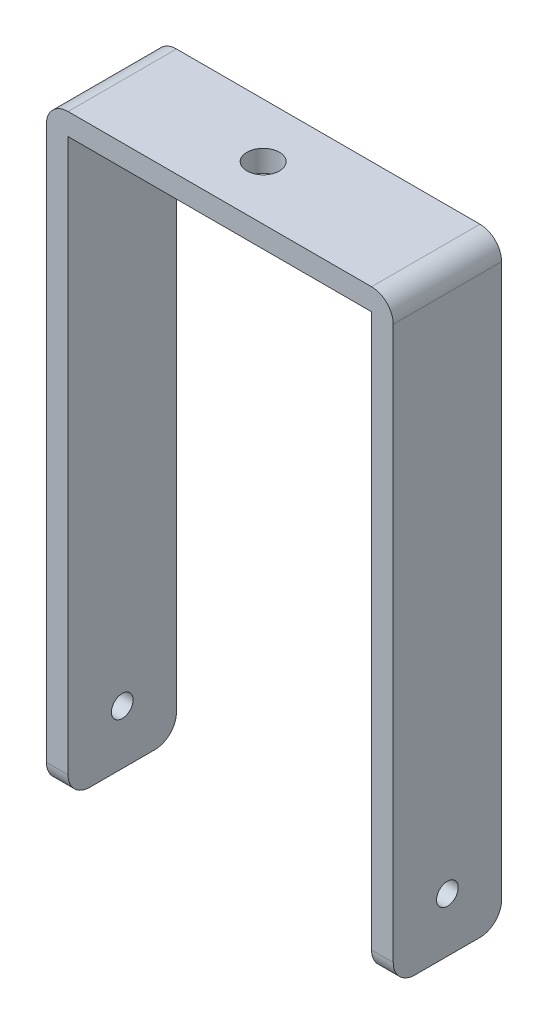
ISO-10303-21;
HEADER;
FILE_DESCRIPTION(('STEP AP214'),'2;1');
FILE_NAME('part.step','',(''),(''),'','','');
FILE_SCHEMA(('AUTOMOTIVE_DESIGN { 1 0 10303 214 1 1 1 1 }'));
ENDSEC;
DATA;
#1=APPLICATION_CONTEXT('core data for automotive mechanical design processes');
#2=APPLICATION_PROTOCOL_DEFINITION('international standard','automotive_design',2000,#1);
#3=PRODUCT_CONTEXT('',#1,'mechanical');
#4=PRODUCT('Part','Part','',(#3));
#5=PRODUCT_RELATED_PRODUCT_CATEGORY('part','',(#4));
#6=PRODUCT_DEFINITION_FORMATION('','',#4);
#7=PRODUCT_DEFINITION_CONTEXT('part definition',#1,'design');
#8=PRODUCT_DEFINITION('design','',#6,#7);
#9=PRODUCT_DEFINITION_SHAPE('','',#8);
#10=(LENGTH_UNIT() NAMED_UNIT(*) SI_UNIT(.MILLI.,.METRE.));
#11=(NAMED_UNIT(*) PLANE_ANGLE_UNIT() SI_UNIT($,.RADIAN.));
#12=(NAMED_UNIT(*) SI_UNIT($,.STERADIAN.) SOLID_ANGLE_UNIT());
#13=UNCERTAINTY_MEASURE_WITH_UNIT(LENGTH_MEASURE(1.E-05),#10,'distance_accuracy_value','');
#14=(GEOMETRIC_REPRESENTATION_CONTEXT(3) GLOBAL_UNCERTAINTY_ASSIGNED_CONTEXT((#13)) GLOBAL_UNIT_ASSIGNED_CONTEXT((#10,
#11,#12)) REPRESENTATION_CONTEXT('',''));
#15=CARTESIAN_POINT('',(0.,0.,0.));
#16=DIRECTION('',(0.,0.,1.));
#17=DIRECTION('',(1.,0.,0.));
#18=AXIS2_PLACEMENT_3D('',#15,#16,#17);
#19=CARTESIAN_POINT('',(10.,0.,50.));
#20=DIRECTION('',(0.,1.,0.));
#21=DIRECTION('',(-1.,0.,0.));
#22=AXIS2_PLACEMENT_3D('',#19,#20,#21);
#23=PLANE('',#22);
#24=DIRECTION('',(0.,0.,-1.));
#25=VECTOR('',#24,1.);
#26=CARTESIAN_POINT('',(10.,0.,50.));
#27=LINE('',#26,#25);
#28=CARTESIAN_POINT('',(10.,0.,40.));
#29=VERTEX_POINT('',#28);
#30=CARTESIAN_POINT('',(10.,0.,10.));
#31=VERTEX_POINT('',#30);
#32=EDGE_CURVE('E155',#29,#31,#27,.T.);
#33=ORIENTED_EDGE('',*,*,#32,.F.);
#34=DIRECTION('',(1.,0.,0.));
#35=VECTOR('',#34,1.);
#36=CARTESIAN_POINT('',(10.,0.,40.));
#37=LINE('',#36,#35);
#38=CARTESIAN_POINT('',(0.,0.,40.));
#39=VERTEX_POINT('',#38);
#40=EDGE_CURVE('E214',#29,#39,#37,.F.);
#41=ORIENTED_EDGE('',*,*,#40,.T.);
#42=DIRECTION('',(0.,0.,-1.));
#43=VECTOR('',#42,1.);
#44=CARTESIAN_POINT('',(0.,0.,50.));
#45=LINE('',#44,#43);
#46=CARTESIAN_POINT('',(0.,0.,10.));
#47=VERTEX_POINT('',#46);
#48=EDGE_CURVE('E174',#39,#47,#45,.T.);
#49=ORIENTED_EDGE('',*,*,#48,.T.);
#50=DIRECTION('',(1.,0.,0.));
#51=VECTOR('',#50,1.);
#52=CARTESIAN_POINT('',(10.,0.,10.));
#53=LINE('',#52,#51);
#54=EDGE_CURVE('E211',#47,#31,#53,.T.);
#55=ORIENTED_EDGE('',*,*,#54,.T.);
#56=EDGE_LOOP('',(#33,#41,#49,#55));
#57=FACE_BOUND('',#56,.T.);
#58=ADVANCED_FACE('F33',(#57),#23,.F.);
#59=CARTESIAN_POINT('',(9.99999999999997,265.,50.));
#60=DIRECTION('',(-1.,0.,0.));
#61=DIRECTION('',(0.,-1.,0.));
#62=AXIS2_PLACEMENT_3D('',#59,#60,#61);
#63=PLANE('',#62);
#64=CARTESIAN_POINT('',(10.,25.,25.));
#65=DIRECTION('',(-1.,0.,0.));
#66=DIRECTION('',(0.,-1.,0.));
#67=AXIS2_PLACEMENT_3D('',#64,#65,#66);
#68=CIRCLE('',#67,5.);
#69=CARTESIAN_POINT('',(10.,20.,25.));
#70=VERTEX_POINT('',#69);
#71=EDGE_CURVE('E177',#70,#70,#68,.T.);
#72=ORIENTED_EDGE('',*,*,#71,.T.);
#73=EDGE_LOOP('',(#72));
#74=FACE_BOUND('',#73,.T.);
#75=DIRECTION('',(0.,1.,0.));
#76=VECTOR('',#75,1.);
#77=CARTESIAN_POINT('',(9.99999999999997,265.,50.));
#78=LINE('',#77,#76);
#79=CARTESIAN_POINT('',(10.,10.,50.));
#80=VERTEX_POINT('',#79);
#81=CARTESIAN_POINT('',(9.99999999999997,265.,50.));
#82=VERTEX_POINT('',#81);
#83=EDGE_CURVE('E135',#80,#82,#78,.T.);
#84=ORIENTED_EDGE('',*,*,#83,.F.);
#85=CARTESIAN_POINT('',(10.,10.,40.));
#86=DIRECTION('',(-1.,0.,0.));
#87=DIRECTION('',(0.,-1.,0.));
#88=AXIS2_PLACEMENT_3D('',#85,#86,#87);
#89=CIRCLE('',#88,10.);
#90=EDGE_CURVE('E209',#80,#29,#89,.F.);
#91=ORIENTED_EDGE('',*,*,#90,.T.);
#92=ORIENTED_EDGE('',*,*,#32,.T.);
#93=CARTESIAN_POINT('',(10.,10.,10.));
#94=DIRECTION('',(-1.,0.,0.));
#95=DIRECTION('',(0.,-1.,0.));
#96=AXIS2_PLACEMENT_3D('',#93,#94,#95);
#97=CIRCLE('',#96,10.);
#98=CARTESIAN_POINT('',(10.,10.,0.));
#99=VERTEX_POINT('',#98);
#100=EDGE_CURVE('E207',#31,#99,#97,.F.);
#101=ORIENTED_EDGE('',*,*,#100,.T.);
#102=DIRECTION('',(0.,1.,0.));
#103=VECTOR('',#102,1.);
#104=CARTESIAN_POINT('',(9.99999999999997,265.,0.));
#105=LINE('',#104,#103);
#106=CARTESIAN_POINT('',(9.99999999999997,265.,0.));
#107=VERTEX_POINT('',#106);
#108=EDGE_CURVE('E152',#99,#107,#105,.T.);
#109=ORIENTED_EDGE('',*,*,#108,.T.);
#110=DIRECTION('',(0.,0.,-1.));
#111=VECTOR('',#110,1.);
#112=CARTESIAN_POINT('',(9.99999999999997,265.,50.));
#113=LINE('',#112,#111);
#114=EDGE_CURVE('E149',#82,#107,#113,.T.);
#115=ORIENTED_EDGE('',*,*,#114,.F.);
#116=EDGE_LOOP('',(#84,#91,#92,#101,#109,#115));
#117=FACE_BOUND('',#116,.T.);
#118=ADVANCED_FACE('F150',(#74,#117),#63,.F.);
#119=CARTESIAN_POINT('',(150.,265.,50.));
#120=DIRECTION('',(0.,1.,0.));
#121=DIRECTION('',(0.,0.,1.));
#122=AXIS2_PLACEMENT_3D('',#119,#120,#121);
#123=PLANE('',#122);
#124=CARTESIAN_POINT('',(74.9999999999999,265.,25.));
#125=DIRECTION('',(0.,1.,0.));
#126=DIRECTION('',(0.,0.,1.));
#127=AXIS2_PLACEMENT_3D('',#124,#125,#126);
#128=CIRCLE('',#127,7.50000000000001);
#129=CARTESIAN_POINT('',(74.9999999999999,265.,32.5));
#130=VERTEX_POINT('',#129);
#131=EDGE_CURVE('E454',#130,#130,#128,.T.);
#132=ORIENTED_EDGE('',*,*,#131,.T.);
#133=EDGE_LOOP('',(#132));
#134=FACE_BOUND('',#133,.T.);
#135=DIRECTION('',(1.,0.,0.));
#136=VECTOR('',#135,1.);
#137=CARTESIAN_POINT('',(150.,265.,0.));
#138=LINE('',#137,#136);
#139=CARTESIAN_POINT('',(150.,265.,0.));
#140=VERTEX_POINT('',#139);
#141=EDGE_CURVE('E176',#107,#140,#138,.T.);
#142=ORIENTED_EDGE('',*,*,#141,.T.);
#143=DIRECTION('',(0.,0.,-1.));
#144=VECTOR('',#143,1.);
#145=CARTESIAN_POINT('',(150.,265.,50.));
#146=LINE('',#145,#144);
#147=CARTESIAN_POINT('',(150.,265.,50.));
#148=VERTEX_POINT('',#147);
#149=EDGE_CURVE('E156',#148,#140,#146,.T.);
#150=ORIENTED_EDGE('',*,*,#149,.F.);
#151=DIRECTION('',(1.,0.,0.));
#152=VECTOR('',#151,1.);
#153=CARTESIAN_POINT('',(150.,265.,50.));
#154=LINE('',#153,#152);
#155=EDGE_CURVE('E141',#82,#148,#154,.T.);
#156=ORIENTED_EDGE('',*,*,#155,.F.);
#157=ORIENTED_EDGE('',*,*,#114,.T.);
#158=EDGE_LOOP('',(#142,#150,#156,#157));
#159=FACE_BOUND('',#158,.T.);
#160=ADVANCED_FACE('F158',(#134,#159),#123,.F.);
#161=CARTESIAN_POINT('',(150.,0.,50.));
#162=DIRECTION('',(1.,0.,0.));
#163=DIRECTION('',(0.,0.,-1.));
#164=AXIS2_PLACEMENT_3D('',#161,#162,#163);
#165=PLANE('',#164);
#166=CARTESIAN_POINT('',(150.,25.,25.));
#167=DIRECTION('',(1.,0.,0.));
#168=DIRECTION('',(0.,0.,-1.));
#169=AXIS2_PLACEMENT_3D('',#166,#167,#168);
#170=CIRCLE('',#169,5.);
#171=CARTESIAN_POINT('',(150.,25.,20.));
#172=VERTEX_POINT('',#171);
#173=EDGE_CURVE('E467',#172,#172,#170,.T.);
#174=ORIENTED_EDGE('',*,*,#173,.T.);
#175=EDGE_LOOP('',(#174));
#176=FACE_BOUND('',#175,.T.);
#177=DIRECTION('',(0.,0.,-1.));
#178=VECTOR('',#177,1.);
#179=CARTESIAN_POINT('',(150.,0.,50.));
#180=LINE('',#179,#178);
#181=CARTESIAN_POINT('',(150.,0.,40.));
#182=VERTEX_POINT('',#181);
#183=CARTESIAN_POINT('',(150.,0.,10.));
#184=VERTEX_POINT('',#183);
#185=EDGE_CURVE('E194',#182,#184,#180,.T.);
#186=ORIENTED_EDGE('',*,*,#185,.F.);
#187=CARTESIAN_POINT('',(150.,10.,40.));
#188=DIRECTION('',(1.,0.,0.));
#189=DIRECTION('',(0.,0.,-1.));
#190=AXIS2_PLACEMENT_3D('',#187,#188,#189);
#191=CIRCLE('',#190,10.);
#192=CARTESIAN_POINT('',(150.,10.,50.));
#193=VERTEX_POINT('',#192);
#194=EDGE_CURVE('E242',#182,#193,#191,.F.);
#195=ORIENTED_EDGE('',*,*,#194,.T.);
#196=DIRECTION('',(0.,-1.,0.));
#197=VECTOR('',#196,1.);
#198=CARTESIAN_POINT('',(150.,0.,50.));
#199=LINE('',#198,#197);
#200=EDGE_CURVE('E161',#148,#193,#199,.T.);
#201=ORIENTED_EDGE('',*,*,#200,.F.);
#202=ORIENTED_EDGE('',*,*,#149,.T.);
#203=DIRECTION('',(0.,-1.,0.));
#204=VECTOR('',#203,1.);
#205=CARTESIAN_POINT('',(150.,0.,0.));
#206=LINE('',#205,#204);
#207=CARTESIAN_POINT('',(150.,10.,0.));
#208=VERTEX_POINT('',#207);
#209=EDGE_CURVE('E179',#140,#208,#206,.T.);
#210=ORIENTED_EDGE('',*,*,#209,.T.);
#211=CARTESIAN_POINT('',(150.,10.,10.));
#212=DIRECTION('',(1.,0.,0.));
#213=DIRECTION('',(0.,0.,-1.));
#214=AXIS2_PLACEMENT_3D('',#211,#212,#213);
#215=CIRCLE('',#214,10.);
#216=EDGE_CURVE('E48',#208,#184,#215,.F.);
#217=ORIENTED_EDGE('',*,*,#216,.T.);
#218=EDGE_LOOP('',(#186,#195,#201,#202,#210,#217));
#219=FACE_BOUND('',#218,.T.);
#220=ADVANCED_FACE('F276',(#176,#219),#165,.F.);
#221=CARTESIAN_POINT('',(160.,0.,50.));
#222=DIRECTION('',(0.,1.,0.));
#223=DIRECTION('',(-1.,0.,0.));
#224=AXIS2_PLACEMENT_3D('',#221,#222,#223);
#225=PLANE('',#224);
#226=DIRECTION('',(0.,0.,-1.));
#227=VECTOR('',#226,1.);
#228=CARTESIAN_POINT('',(160.,0.,50.));
#229=LINE('',#228,#227);
#230=CARTESIAN_POINT('',(160.,0.,40.));
#231=VERTEX_POINT('',#230);
#232=CARTESIAN_POINT('',(160.,0.,10.));
#233=VERTEX_POINT('',#232);
#234=EDGE_CURVE('E191',#231,#233,#229,.T.);
#235=ORIENTED_EDGE('',*,*,#234,.F.);
#236=DIRECTION('',(1.,0.,0.));
#237=VECTOR('',#236,1.);
#238=CARTESIAN_POINT('',(160.,0.,40.));
#239=LINE('',#238,#237);
#240=EDGE_CURVE('E55',#231,#182,#239,.F.);
#241=ORIENTED_EDGE('',*,*,#240,.T.);
#242=ORIENTED_EDGE('',*,*,#185,.T.);
#243=DIRECTION('',(1.,0.,0.));
#244=VECTOR('',#243,1.);
#245=CARTESIAN_POINT('',(160.,0.,10.));
#246=LINE('',#245,#244);
#247=EDGE_CURVE('E237',#184,#233,#246,.T.);
#248=ORIENTED_EDGE('',*,*,#247,.T.);
#249=EDGE_LOOP('',(#235,#241,#242,#248));
#250=FACE_BOUND('',#249,.T.);
#251=ADVANCED_FACE('F284',(#250),#225,.F.);
#252=CARTESIAN_POINT('',(160.,275.,50.));
#253=DIRECTION('',(-1.,0.,0.));
#254=DIRECTION('',(0.,-1.,0.));
#255=AXIS2_PLACEMENT_3D('',#252,#253,#254);
#256=PLANE('',#255);
#257=CARTESIAN_POINT('',(160.,25.,25.));
#258=DIRECTION('',(-1.,0.,0.));
#259=DIRECTION('',(0.,-1.,0.));
#260=AXIS2_PLACEMENT_3D('',#257,#258,#259);
#261=CIRCLE('',#260,5.);
#262=CARTESIAN_POINT('',(160.,20.,25.));
#263=VERTEX_POINT('',#262);
#264=EDGE_CURVE('E464',#263,#263,#261,.T.);
#265=ORIENTED_EDGE('',*,*,#264,.T.);
#266=EDGE_LOOP('',(#265));
#267=FACE_BOUND('',#266,.T.);
#268=DIRECTION('',(0.,1.,0.));
#269=VECTOR('',#268,1.);
#270=CARTESIAN_POINT('',(160.,275.,50.));
#271=LINE('',#270,#269);
#272=CARTESIAN_POINT('',(160.,10.,50.));
#273=VERTEX_POINT('',#272);
#274=CARTESIAN_POINT('',(160.,265.,50.));
#275=VERTEX_POINT('',#274);
#276=EDGE_CURVE('E163',#273,#275,#271,.T.);
#277=ORIENTED_EDGE('',*,*,#276,.F.);
#278=CARTESIAN_POINT('',(160.,10.,40.));
#279=DIRECTION('',(-1.,0.,0.));
#280=DIRECTION('',(0.,-1.,0.));
#281=AXIS2_PLACEMENT_3D('',#278,#279,#280);
#282=CIRCLE('',#281,10.);
#283=EDGE_CURVE('E235',#273,#231,#282,.F.);
#284=ORIENTED_EDGE('',*,*,#283,.T.);
#285=ORIENTED_EDGE('',*,*,#234,.T.);
#286=CARTESIAN_POINT('',(160.,10.,10.));
#287=DIRECTION('',(-1.,0.,0.));
#288=DIRECTION('',(0.,-1.,0.));
#289=AXIS2_PLACEMENT_3D('',#286,#287,#288);
#290=CIRCLE('',#289,10.);
#291=CARTESIAN_POINT('',(160.,10.,0.));
#292=VERTEX_POINT('',#291);
#293=EDGE_CURVE('E233',#233,#292,#290,.F.);
#294=ORIENTED_EDGE('',*,*,#293,.T.);
#295=DIRECTION('',(0.,1.,0.));
#296=VECTOR('',#295,1.);
#297=CARTESIAN_POINT('',(160.,275.,0.));
#298=LINE('',#297,#296);
#299=CARTESIAN_POINT('',(160.,265.,0.));
#300=VERTEX_POINT('',#299);
#301=EDGE_CURVE('E181',#292,#300,#298,.T.);
#302=ORIENTED_EDGE('',*,*,#301,.T.);
#303=DIRECTION('',(0.,0.,-1.));
#304=VECTOR('',#303,1.);
#305=CARTESIAN_POINT('',(160.,265.,50.));
#306=LINE('',#305,#304);
#307=EDGE_CURVE('E231',#300,#275,#306,.F.);
#308=ORIENTED_EDGE('',*,*,#307,.T.);
#309=EDGE_LOOP('',(#277,#284,#285,#294,#302,#308));
#310=FACE_BOUND('',#309,.T.);
#311=ADVANCED_FACE('F283',(#267,#310),#256,.F.);
#312=CARTESIAN_POINT('',(0.,275.,50.));
#313=DIRECTION('',(0.,-1.,0.));
#314=DIRECTION('',(0.,0.,-1.));
#315=AXIS2_PLACEMENT_3D('',#312,#313,#314);
#316=PLANE('',#315);
#317=CARTESIAN_POINT('',(74.9999999999999,275.,25.));
#318=DIRECTION('',(0.,1.,0.));
#319=DIRECTION('',(0.,0.,1.));
#320=AXIS2_PLACEMENT_3D('',#317,#318,#319);
#321=CIRCLE('',#320,7.50000000000001);
#322=CARTESIAN_POINT('',(74.9999999999999,275.,32.5));
#323=VERTEX_POINT('',#322);
#324=EDGE_CURVE('E457',#323,#323,#321,.T.);
#325=ORIENTED_EDGE('',*,*,#324,.F.);
#326=EDGE_LOOP('',(#325));
#327=FACE_BOUND('',#326,.T.);
#328=DIRECTION('',(-1.,0.,0.));
#329=VECTOR('',#328,1.);
#330=CARTESIAN_POINT('',(0.,275.,0.));
#331=LINE('',#330,#329);
#332=CARTESIAN_POINT('',(150.,275.,0.));
#333=VERTEX_POINT('',#332);
#334=CARTESIAN_POINT('',(9.99999999999997,275.,0.));
#335=VERTEX_POINT('',#334);
#336=EDGE_CURVE('E184',#333,#335,#331,.T.);
#337=ORIENTED_EDGE('',*,*,#336,.T.);
#338=DIRECTION('',(0.,0.,-1.));
#339=VECTOR('',#338,1.);
#340=CARTESIAN_POINT('',(9.99999999999997,275.,50.));
#341=LINE('',#340,#339);
#342=CARTESIAN_POINT('',(9.99999999999997,275.,50.));
#343=VERTEX_POINT('',#342);
#344=EDGE_CURVE('E11',#335,#343,#341,.F.);
#345=ORIENTED_EDGE('',*,*,#344,.T.);
#346=DIRECTION('',(-1.,0.,0.));
#347=VECTOR('',#346,1.);
#348=CARTESIAN_POINT('',(0.,275.,50.));
#349=LINE('',#348,#347);
#350=CARTESIAN_POINT('',(150.,275.,50.));
#351=VERTEX_POINT('',#350);
#352=EDGE_CURVE('E169',#351,#343,#349,.T.);
#353=ORIENTED_EDGE('',*,*,#352,.F.);
#354=DIRECTION('',(0.,0.,-1.));
#355=VECTOR('',#354,1.);
#356=CARTESIAN_POINT('',(150.,275.,50.));
#357=LINE('',#356,#355);
#358=EDGE_CURVE('E41',#351,#333,#357,.T.);
#359=ORIENTED_EDGE('',*,*,#358,.T.);
#360=EDGE_LOOP('',(#337,#345,#353,#359));
#361=FACE_BOUND('',#360,.T.);
#362=ADVANCED_FACE('F248',(#327,#361),#316,.F.);
#363=CARTESIAN_POINT('',(0.,0.,50.));
#364=DIRECTION('',(1.,0.,0.));
#365=DIRECTION('',(0.,1.,0.));
#366=AXIS2_PLACEMENT_3D('',#363,#364,#365);
#367=PLANE('',#366);
#368=CARTESIAN_POINT('',(0.,25.,25.));
#369=DIRECTION('',(-1.,0.,0.));
#370=DIRECTION('',(0.,-1.,0.));
#371=AXIS2_PLACEMENT_3D('',#368,#369,#370);
#372=CIRCLE('',#371,5.);
#373=CARTESIAN_POINT('',(0.,20.,25.));
#374=VERTEX_POINT('',#373);
#375=EDGE_CURVE('E459',#374,#374,#372,.T.);
#376=ORIENTED_EDGE('',*,*,#375,.F.);
#377=EDGE_LOOP('',(#376));
#378=FACE_BOUND('',#377,.T.);
#379=ORIENTED_EDGE('',*,*,#48,.F.);
#380=CARTESIAN_POINT('',(0.,10.,40.));
#381=DIRECTION('',(1.,0.,0.));
#382=DIRECTION('',(0.,1.,0.));
#383=AXIS2_PLACEMENT_3D('',#380,#381,#382);
#384=CIRCLE('',#383,10.);
#385=CARTESIAN_POINT('',(0.,10.,50.));
#386=VERTEX_POINT('',#385);
#387=EDGE_CURVE('E221',#39,#386,#384,.F.);
#388=ORIENTED_EDGE('',*,*,#387,.T.);
#389=DIRECTION('',(0.,-1.,0.));
#390=VECTOR('',#389,1.);
#391=CARTESIAN_POINT('',(0.,0.,50.));
#392=LINE('',#391,#390);
#393=CARTESIAN_POINT('',(0.,265.,50.));
#394=VERTEX_POINT('',#393);
#395=EDGE_CURVE('E172',#394,#386,#392,.T.);
#396=ORIENTED_EDGE('',*,*,#395,.F.);
#397=DIRECTION('',(0.,0.,-1.));
#398=VECTOR('',#397,1.);
#399=CARTESIAN_POINT('',(0.,265.,50.));
#400=LINE('',#399,#398);
#401=CARTESIAN_POINT('',(0.,265.,0.));
#402=VERTEX_POINT('',#401);
#403=EDGE_CURVE('E216',#394,#402,#400,.T.);
#404=ORIENTED_EDGE('',*,*,#403,.T.);
#405=DIRECTION('',(0.,-1.,0.));
#406=VECTOR('',#405,1.);
#407=CARTESIAN_POINT('',(0.,0.,0.));
#408=LINE('',#407,#406);
#409=CARTESIAN_POINT('',(0.,10.,0.));
#410=VERTEX_POINT('',#409);
#411=EDGE_CURVE('E146',#402,#410,#408,.T.);
#412=ORIENTED_EDGE('',*,*,#411,.T.);
#413=CARTESIAN_POINT('',(0.,10.,10.));
#414=DIRECTION('',(1.,0.,0.));
#415=DIRECTION('',(0.,1.,0.));
#416=AXIS2_PLACEMENT_3D('',#413,#414,#415);
#417=CIRCLE('',#416,10.);
#418=EDGE_CURVE('E219',#410,#47,#417,.F.);
#419=ORIENTED_EDGE('',*,*,#418,.T.);
#420=EDGE_LOOP('',(#379,#388,#396,#404,#412,#419));
#421=FACE_BOUND('',#420,.T.);
#422=ADVANCED_FACE('F263',(#378,#421),#367,.F.);
#423=CARTESIAN_POINT('',(0.,0.,50.));
#424=DIRECTION('',(0.,0.,-1.));
#425=DIRECTION('',(-1.,0.,0.));
#426=AXIS2_PLACEMENT_3D('',#423,#424,#425);
#427=PLANE('',#426);
#428=ORIENTED_EDGE('',*,*,#395,.T.);
#429=DIRECTION('',(1.,0.,0.));
#430=VECTOR('',#429,1.);
#431=CARTESIAN_POINT('',(0.,10.,50.));
#432=LINE('',#431,#430);
#433=EDGE_CURVE('E144',#386,#80,#432,.T.);
#434=ORIENTED_EDGE('',*,*,#433,.T.);
#435=ORIENTED_EDGE('',*,*,#83,.T.);
#436=ORIENTED_EDGE('',*,*,#155,.T.);
#437=ORIENTED_EDGE('',*,*,#200,.T.);
#438=DIRECTION('',(1.,0.,0.));
#439=VECTOR('',#438,1.);
#440=CARTESIAN_POINT('',(0.,9.99999999999965,50.));
#441=LINE('',#440,#439);
#442=EDGE_CURVE('E203',#193,#273,#441,.T.);
#443=ORIENTED_EDGE('',*,*,#442,.T.);
#444=ORIENTED_EDGE('',*,*,#276,.T.);
#445=CARTESIAN_POINT('',(150.,265.,50.));
#446=DIRECTION('',(0.,0.,-1.));
#447=DIRECTION('',(-1.,0.,0.));
#448=AXIS2_PLACEMENT_3D('',#445,#446,#447);
#449=CIRCLE('',#448,10.);
#450=EDGE_CURVE('E199',#275,#351,#449,.F.);
#451=ORIENTED_EDGE('',*,*,#450,.T.);
#452=ORIENTED_EDGE('',*,*,#352,.T.);
#453=CARTESIAN_POINT('',(9.99999999999997,265.,50.));
#454=DIRECTION('',(0.,0.,-1.));
#455=DIRECTION('',(-1.,0.,0.));
#456=AXIS2_PLACEMENT_3D('',#453,#454,#455);
#457=CIRCLE('',#456,10.);
#458=EDGE_CURVE('E201',#343,#394,#457,.F.);
#459=ORIENTED_EDGE('',*,*,#458,.T.);
#460=EDGE_LOOP('',(#428,#434,#435,#436,#437,#443,#444,#451,#452,#459));
#461=FACE_BOUND('',#460,.T.);
#462=ADVANCED_FACE('F138',(#461),#427,.F.);
#463=CARTESIAN_POINT('',(0.,0.,0.));
#464=DIRECTION('',(0.,0.,-1.));
#465=DIRECTION('',(-1.,0.,0.));
#466=AXIS2_PLACEMENT_3D('',#463,#464,#465);
#467=PLANE('',#466);
#468=ORIENTED_EDGE('',*,*,#108,.F.);
#469=DIRECTION('',(1.,0.,0.));
#470=VECTOR('',#469,1.);
#471=CARTESIAN_POINT('',(0.,10.,0.));
#472=LINE('',#471,#470);
#473=EDGE_CURVE('E229',#99,#410,#472,.F.);
#474=ORIENTED_EDGE('',*,*,#473,.T.);
#475=ORIENTED_EDGE('',*,*,#411,.F.);
#476=CARTESIAN_POINT('',(9.99999999999997,265.,0.));
#477=DIRECTION('',(0.,0.,-1.));
#478=DIRECTION('',(-1.,0.,0.));
#479=AXIS2_PLACEMENT_3D('',#476,#477,#478);
#480=CIRCLE('',#479,10.);
#481=EDGE_CURVE('E225',#402,#335,#480,.T.);
#482=ORIENTED_EDGE('',*,*,#481,.T.);
#483=ORIENTED_EDGE('',*,*,#336,.F.);
#484=CARTESIAN_POINT('',(150.,265.,0.));
#485=DIRECTION('',(0.,0.,-1.));
#486=DIRECTION('',(-1.,0.,0.));
#487=AXIS2_PLACEMENT_3D('',#484,#485,#486);
#488=CIRCLE('',#487,10.);
#489=EDGE_CURVE('E223',#333,#300,#488,.T.);
#490=ORIENTED_EDGE('',*,*,#489,.T.);
#491=ORIENTED_EDGE('',*,*,#301,.F.);
#492=DIRECTION('',(1.,0.,0.));
#493=VECTOR('',#492,1.);
#494=CARTESIAN_POINT('',(150.,10.,0.));
#495=LINE('',#494,#493);
#496=EDGE_CURVE('E227',#292,#208,#495,.F.);
#497=ORIENTED_EDGE('',*,*,#496,.T.);
#498=ORIENTED_EDGE('',*,*,#209,.F.);
#499=ORIENTED_EDGE('',*,*,#141,.F.);
#500=EDGE_LOOP('',(#468,#474,#475,#482,#483,#490,#491,#497,#498,#499));
#501=FACE_BOUND('',#500,.T.);
#502=ADVANCED_FACE('F253',(#501),#467,.T.);
#503=CARTESIAN_POINT('',(0.,10.,40.));
#504=DIRECTION('',(1.,0.,0.));
#505=DIRECTION('',(0.,1.,0.));
#506=AXIS2_PLACEMENT_3D('',#503,#504,#505);
#507=CYLINDRICAL_SURFACE('',#506,10.);
#508=ORIENTED_EDGE('',*,*,#387,.F.);
#509=ORIENTED_EDGE('',*,*,#40,.F.);
#510=ORIENTED_EDGE('',*,*,#90,.F.);
#511=ORIENTED_EDGE('',*,*,#433,.F.);
#512=EDGE_LOOP('',(#508,#509,#510,#511));
#513=FACE_BOUND('',#512,.T.);
#514=ADVANCED_FACE('F267',(#513),#507,.T.);
#515=CARTESIAN_POINT('',(10.,10.,10.));
#516=DIRECTION('',(-1.,0.,0.));
#517=DIRECTION('',(0.,-1.,0.));
#518=AXIS2_PLACEMENT_3D('',#515,#516,#517);
#519=CYLINDRICAL_SURFACE('',#518,10.);
#520=ORIENTED_EDGE('',*,*,#418,.F.);
#521=ORIENTED_EDGE('',*,*,#473,.F.);
#522=ORIENTED_EDGE('',*,*,#100,.F.);
#523=ORIENTED_EDGE('',*,*,#54,.F.);
#524=EDGE_LOOP('',(#520,#521,#522,#523));
#525=FACE_BOUND('',#524,.T.);
#526=ADVANCED_FACE('F273',(#525),#519,.T.);
#527=CARTESIAN_POINT('',(0.,9.99999999999965,40.));
#528=DIRECTION('',(1.,0.,0.));
#529=DIRECTION('',(0.,1.,0.));
#530=AXIS2_PLACEMENT_3D('',#527,#528,#529);
#531=CYLINDRICAL_SURFACE('',#530,10.);
#532=ORIENTED_EDGE('',*,*,#194,.F.);
#533=ORIENTED_EDGE('',*,*,#240,.F.);
#534=ORIENTED_EDGE('',*,*,#283,.F.);
#535=ORIENTED_EDGE('',*,*,#442,.F.);
#536=EDGE_LOOP('',(#532,#533,#534,#535));
#537=FACE_BOUND('',#536,.T.);
#538=ADVANCED_FACE('F281',(#537),#531,.T.);
#539=CARTESIAN_POINT('',(160.,10.,10.));
#540=DIRECTION('',(-1.,0.,0.));
#541=DIRECTION('',(0.,-1.,0.));
#542=AXIS2_PLACEMENT_3D('',#539,#540,#541);
#543=CYLINDRICAL_SURFACE('',#542,10.);
#544=ORIENTED_EDGE('',*,*,#216,.F.);
#545=ORIENTED_EDGE('',*,*,#496,.F.);
#546=ORIENTED_EDGE('',*,*,#293,.F.);
#547=ORIENTED_EDGE('',*,*,#247,.F.);
#548=EDGE_LOOP('',(#544,#545,#546,#547));
#549=FACE_BOUND('',#548,.T.);
#550=ADVANCED_FACE('F287',(#549),#543,.T.);
#551=CARTESIAN_POINT('',(9.99999999999997,265.,50.));
#552=DIRECTION('',(0.,0.,-1.));
#553=DIRECTION('',(-1.,0.,0.));
#554=AXIS2_PLACEMENT_3D('',#551,#552,#553);
#555=CYLINDRICAL_SURFACE('',#554,10.);
#556=ORIENTED_EDGE('',*,*,#458,.F.);
#557=ORIENTED_EDGE('',*,*,#344,.F.);
#558=ORIENTED_EDGE('',*,*,#481,.F.);
#559=ORIENTED_EDGE('',*,*,#403,.F.);
#560=EDGE_LOOP('',(#556,#557,#558,#559));
#561=FACE_BOUND('',#560,.T.);
#562=ADVANCED_FACE('F259',(#561),#555,.T.);
#563=CARTESIAN_POINT('',(150.,265.,50.));
#564=DIRECTION('',(0.,0.,-1.));
#565=DIRECTION('',(-1.,0.,0.));
#566=AXIS2_PLACEMENT_3D('',#563,#564,#565);
#567=CYLINDRICAL_SURFACE('',#566,10.);
#568=ORIENTED_EDGE('',*,*,#450,.F.);
#569=ORIENTED_EDGE('',*,*,#307,.F.);
#570=ORIENTED_EDGE('',*,*,#489,.F.);
#571=ORIENTED_EDGE('',*,*,#358,.F.);
#572=EDGE_LOOP('',(#568,#569,#570,#571));
#573=FACE_BOUND('',#572,.T.);
#574=ADVANCED_FACE('F35',(#573),#567,.T.);
#575=CARTESIAN_POINT('',(170.,25.,25.));
#576=DIRECTION('',(-1.,0.,0.));
#577=DIRECTION('',(0.,-1.,0.));
#578=AXIS2_PLACEMENT_3D('',#575,#576,#577);
#579=CYLINDRICAL_SURFACE('',#578,5.);
#580=ORIENTED_EDGE('',*,*,#375,.T.);
#581=EDGE_LOOP('',(#580));
#582=FACE_BOUND('',#581,.T.);
#583=ORIENTED_EDGE('',*,*,#71,.F.);
#584=EDGE_LOOP('',(#583));
#585=FACE_BOUND('',#584,.T.);
#586=ADVANCED_FACE('F291',(#582,#585),#579,.F.);
#587=ORIENTED_EDGE('',*,*,#264,.F.);
#588=EDGE_LOOP('',(#587));
#589=FACE_BOUND('',#588,.T.);
#590=ORIENTED_EDGE('',*,*,#173,.F.);
#591=EDGE_LOOP('',(#590));
#592=FACE_BOUND('',#591,.T.);
#593=ADVANCED_FACE('F296',(#589,#592),#579,.F.);
#594=CARTESIAN_POINT('',(74.9999999999999,265.,25.));
#595=DIRECTION('',(0.,1.,0.));
#596=DIRECTION('',(0.,0.,1.));
#597=AXIS2_PLACEMENT_3D('',#594,#595,#596);
#598=CYLINDRICAL_SURFACE('',#597,7.50000000000001);
#599=ORIENTED_EDGE('',*,*,#131,.F.);
#600=EDGE_LOOP('',(#599));
#601=FACE_BOUND('',#600,.T.);
#602=ORIENTED_EDGE('',*,*,#324,.T.);
#603=EDGE_LOOP('',(#602));
#604=FACE_BOUND('',#603,.T.);
#605=ADVANCED_FACE('F384',(#601,#604),#598,.F.);
#606=CLOSED_SHELL('',(#58,#118,#160,#220,#251,#311,#362,#422,#462,#502,#514,#526,#538,#550,#562,
#574,#586,#593,#605));
#607=MANIFOLD_SOLID_BREP('B2',#606);
#608=ADVANCED_BREP_SHAPE_REPRESENTATION('',(#18,#607),#14);
#609=SHAPE_DEFINITION_REPRESENTATION(#9,#608);
ENDSEC;
END-ISO-10303-21;
